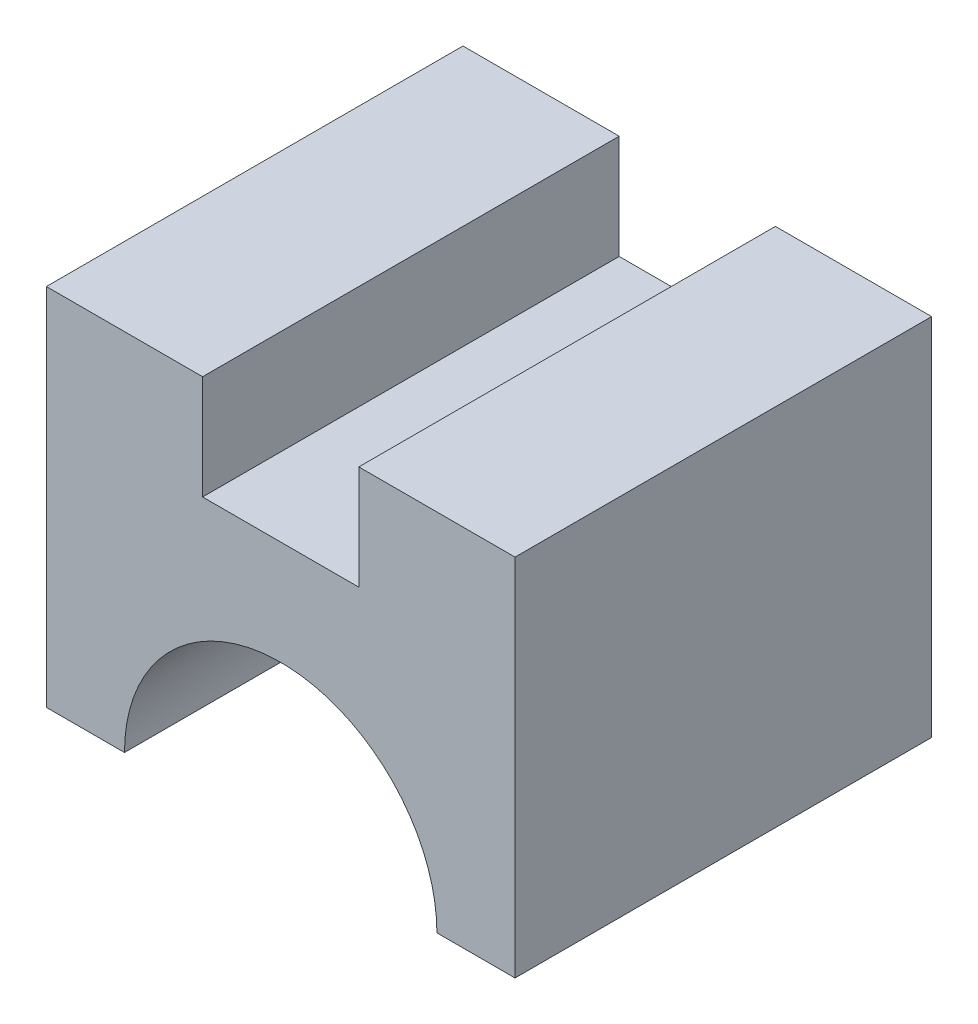
ISO-10303-21;
HEADER;
FILE_DESCRIPTION(('STEP AP214'),'2;1');
FILE_NAME('part.step','',(''),(''),'','','');
FILE_SCHEMA(('AUTOMOTIVE_DESIGN { 1 0 10303 214 1 1 1 1 }'));
ENDSEC;
DATA;
#1=APPLICATION_CONTEXT('core data for automotive mechanical design processes');
#2=APPLICATION_PROTOCOL_DEFINITION('international standard','automotive_design',2000,#1);
#3=PRODUCT_CONTEXT('',#1,'mechanical');
#4=PRODUCT('Part','Part','',(#3));
#5=PRODUCT_RELATED_PRODUCT_CATEGORY('part','',(#4));
#6=PRODUCT_DEFINITION_FORMATION('','',#4);
#7=PRODUCT_DEFINITION_CONTEXT('part definition',#1,'design');
#8=PRODUCT_DEFINITION('design','',#6,#7);
#9=PRODUCT_DEFINITION_SHAPE('','',#8);
#10=(LENGTH_UNIT() NAMED_UNIT(*) SI_UNIT(.MILLI.,.METRE.));
#11=(NAMED_UNIT(*) PLANE_ANGLE_UNIT() SI_UNIT($,.RADIAN.));
#12=(NAMED_UNIT(*) SI_UNIT($,.STERADIAN.) SOLID_ANGLE_UNIT());
#13=UNCERTAINTY_MEASURE_WITH_UNIT(LENGTH_MEASURE(1.E-05),#10,'distance_accuracy_value','');
#14=(GEOMETRIC_REPRESENTATION_CONTEXT(3) GLOBAL_UNCERTAINTY_ASSIGNED_CONTEXT((#13)) GLOBAL_UNIT_ASSIGNED_CONTEXT((#10,
#11,#12)) REPRESENTATION_CONTEXT('',''));
#15=CARTESIAN_POINT('',(0.,0.,0.));
#16=DIRECTION('',(0.,0.,1.));
#17=DIRECTION('',(1.,0.,0.));
#18=AXIS2_PLACEMENT_3D('',#15,#16,#17);
#19=CARTESIAN_POINT('',(0.,0.,1016.));
#20=DIRECTION('',(0.,0.,-1.));
#21=DIRECTION('',(-1.,0.,0.));
#22=AXIS2_PLACEMENT_3D('',#19,#20,#21);
#23=CYLINDRICAL_SURFACE('',#22,381.);
#24=CARTESIAN_POINT('',(0.,0.,0.));
#25=DIRECTION('',(0.,0.,-1.));
#26=DIRECTION('',(-1.,0.,0.));
#27=AXIS2_PLACEMENT_3D('',#24,#25,#26);
#28=CIRCLE('',#27,381.);
#29=CARTESIAN_POINT('',(-381.,0.,0.));
#30=VERTEX_POINT('',#29);
#31=CARTESIAN_POINT('',(381.,0.,0.));
#32=VERTEX_POINT('',#31);
#33=EDGE_CURVE('E141',#30,#32,#28,.T.);
#34=ORIENTED_EDGE('',*,*,#33,.T.);
#35=DIRECTION('',(0.,0.,-1.));
#36=VECTOR('',#35,1.);
#37=CARTESIAN_POINT('',(381.,0.,1016.));
#38=LINE('',#37,#36);
#39=CARTESIAN_POINT('',(381.,0.,1016.));
#40=VERTEX_POINT('',#39);
#41=EDGE_CURVE('E11',#40,#32,#38,.T.);
#42=ORIENTED_EDGE('',*,*,#41,.F.);
#43=CARTESIAN_POINT('',(0.,0.,1016.));
#44=DIRECTION('',(0.,0.,-1.));
#45=DIRECTION('',(-1.,0.,0.));
#46=AXIS2_PLACEMENT_3D('',#43,#44,#45);
#47=CIRCLE('',#46,381.);
#48=CARTESIAN_POINT('',(-381.,0.,1016.));
#49=VERTEX_POINT('',#48);
#50=EDGE_CURVE('E159',#49,#40,#47,.T.);
#51=ORIENTED_EDGE('',*,*,#50,.F.);
#52=DIRECTION('',(0.,0.,-1.));
#53=VECTOR('',#52,1.);
#54=CARTESIAN_POINT('',(-381.,0.,1016.));
#55=LINE('',#54,#53);
#56=EDGE_CURVE('E137',#49,#30,#55,.T.);
#57=ORIENTED_EDGE('',*,*,#56,.T.);
#58=EDGE_LOOP('',(#34,#42,#51,#57));
#59=FACE_BOUND('',#58,.T.);
#60=ADVANCED_FACE('F33',(#59),#23,.F.);
#61=CARTESIAN_POINT('',(381.,0.,1016.));
#62=DIRECTION('',(0.,1.,0.));
#63=DIRECTION('',(-1.,0.,0.));
#64=AXIS2_PLACEMENT_3D('',#61,#62,#63);
#65=PLANE('',#64);
#66=DIRECTION('',(1.,0.,0.));
#67=VECTOR('',#66,1.);
#68=CARTESIAN_POINT('',(381.,0.,0.));
#69=LINE('',#68,#67);
#70=CARTESIAN_POINT('',(571.5,1.98715083401274E-13,0.));
#71=VERTEX_POINT('',#70);
#72=EDGE_CURVE('E144',#32,#71,#69,.T.);
#73=ORIENTED_EDGE('',*,*,#72,.T.);
#74=DIRECTION('',(0.,0.,-1.));
#75=VECTOR('',#74,1.);
#76=CARTESIAN_POINT('',(571.5,1.98715083401274E-13,1016.));
#77=LINE('',#76,#75);
#78=CARTESIAN_POINT('',(571.5,1.98715083401274E-13,1016.));
#79=VERTEX_POINT('',#78);
#80=EDGE_CURVE('E41',#79,#71,#77,.T.);
#81=ORIENTED_EDGE('',*,*,#80,.F.);
#82=DIRECTION('',(1.,0.,0.));
#83=VECTOR('',#82,1.);
#84=CARTESIAN_POINT('',(381.,0.,1016.));
#85=LINE('',#84,#83);
#86=EDGE_CURVE('E98',#40,#79,#85,.T.);
#87=ORIENTED_EDGE('',*,*,#86,.F.);
#88=ORIENTED_EDGE('',*,*,#41,.T.);
#89=EDGE_LOOP('',(#73,#81,#87,#88));
#90=FACE_BOUND('',#89,.T.);
#91=ADVANCED_FACE('F208',(#90),#65,.F.);
#92=CARTESIAN_POINT('',(571.5,1.98715083401274E-13,1016.));
#93=DIRECTION('',(-1.,0.,0.));
#94=DIRECTION('',(0.,-1.,0.));
#95=AXIS2_PLACEMENT_3D('',#92,#93,#94);
#96=PLANE('',#95);
#97=DIRECTION('',(0.,1.,0.));
#98=VECTOR('',#97,1.);
#99=CARTESIAN_POINT('',(571.5,1.98715083401274E-13,0.));
#100=LINE('',#99,#98);
#101=CARTESIAN_POINT('',(571.5,889.,0.));
#102=VERTEX_POINT('',#101);
#103=EDGE_CURVE('E146',#71,#102,#100,.T.);
#104=ORIENTED_EDGE('',*,*,#103,.T.);
#105=DIRECTION('',(0.,0.,-1.));
#106=VECTOR('',#105,1.);
#107=CARTESIAN_POINT('',(571.5,889.,1016.));
#108=LINE('',#107,#106);
#109=CARTESIAN_POINT('',(571.5,889.,1016.));
#110=VERTEX_POINT('',#109);
#111=EDGE_CURVE('E172',#110,#102,#108,.T.);
#112=ORIENTED_EDGE('',*,*,#111,.F.);
#113=DIRECTION('',(0.,1.,0.));
#114=VECTOR('',#113,1.);
#115=CARTESIAN_POINT('',(571.5,1.98715083401274E-13,1016.));
#116=LINE('',#115,#114);
#117=EDGE_CURVE('E180',#79,#110,#116,.T.);
#118=ORIENTED_EDGE('',*,*,#117,.F.);
#119=ORIENTED_EDGE('',*,*,#80,.T.);
#120=EDGE_LOOP('',(#104,#112,#118,#119));
#121=FACE_BOUND('',#120,.T.);
#122=ADVANCED_FACE('F178',(#121),#96,.F.);
#123=CARTESIAN_POINT('',(571.5,889.,1016.));
#124=DIRECTION('',(0.,-1.,0.));
#125=DIRECTION('',(1.,0.,0.));
#126=AXIS2_PLACEMENT_3D('',#123,#124,#125);
#127=PLANE('',#126);
#128=DIRECTION('',(-1.,0.,0.));
#129=VECTOR('',#128,1.);
#130=CARTESIAN_POINT('',(571.5,889.,0.));
#131=LINE('',#130,#129);
#132=CARTESIAN_POINT('',(190.5,889.,0.));
#133=VERTEX_POINT('',#132);
#134=EDGE_CURVE('E148',#102,#133,#131,.T.);
#135=ORIENTED_EDGE('',*,*,#134,.T.);
#136=DIRECTION('',(0.,0.,-1.));
#137=VECTOR('',#136,1.);
#138=CARTESIAN_POINT('',(190.5,889.,1016.));
#139=LINE('',#138,#137);
#140=CARTESIAN_POINT('',(190.5,889.,1016.));
#141=VERTEX_POINT('',#140);
#142=EDGE_CURVE('E169',#141,#133,#139,.T.);
#143=ORIENTED_EDGE('',*,*,#142,.F.);
#144=DIRECTION('',(-1.,0.,0.));
#145=VECTOR('',#144,1.);
#146=CARTESIAN_POINT('',(571.5,889.,1016.));
#147=LINE('',#146,#145);
#148=EDGE_CURVE('E198',#110,#141,#147,.T.);
#149=ORIENTED_EDGE('',*,*,#148,.F.);
#150=ORIENTED_EDGE('',*,*,#111,.T.);
#151=EDGE_LOOP('',(#135,#143,#149,#150));
#152=FACE_BOUND('',#151,.T.);
#153=ADVANCED_FACE('F189',(#152),#127,.F.);
#154=CARTESIAN_POINT('',(190.5,889.,1016.));
#155=DIRECTION('',(1.,0.,0.));
#156=DIRECTION('',(0.,1.,0.));
#157=AXIS2_PLACEMENT_3D('',#154,#155,#156);
#158=PLANE('',#157);
#159=DIRECTION('',(0.,-1.,0.));
#160=VECTOR('',#159,1.);
#161=CARTESIAN_POINT('',(190.5,889.,0.));
#162=LINE('',#161,#160);
#163=CARTESIAN_POINT('',(190.5,635.,0.));
#164=VERTEX_POINT('',#163);
#165=EDGE_CURVE('E150',#133,#164,#162,.T.);
#166=ORIENTED_EDGE('',*,*,#165,.T.);
#167=DIRECTION('',(0.,0.,-1.));
#168=VECTOR('',#167,1.);
#169=CARTESIAN_POINT('',(190.5,635.,1016.));
#170=LINE('',#169,#168);
#171=CARTESIAN_POINT('',(190.5,635.,1016.));
#172=VERTEX_POINT('',#171);
#173=EDGE_CURVE('E166',#172,#164,#170,.T.);
#174=ORIENTED_EDGE('',*,*,#173,.F.);
#175=DIRECTION('',(0.,-1.,0.));
#176=VECTOR('',#175,1.);
#177=CARTESIAN_POINT('',(190.5,889.,1016.));
#178=LINE('',#177,#176);
#179=EDGE_CURVE('E195',#141,#172,#178,.T.);
#180=ORIENTED_EDGE('',*,*,#179,.F.);
#181=ORIENTED_EDGE('',*,*,#142,.T.);
#182=EDGE_LOOP('',(#166,#174,#180,#181));
#183=FACE_BOUND('',#182,.T.);
#184=ADVANCED_FACE('F193',(#183),#158,.F.);
#185=CARTESIAN_POINT('',(-190.5,635.,1016.));
#186=DIRECTION('',(0.,-1.,0.));
#187=DIRECTION('',(0.,0.,-1.));
#188=AXIS2_PLACEMENT_3D('',#185,#186,#187);
#189=PLANE('',#188);
#190=DIRECTION('',(-1.,0.,0.));
#191=VECTOR('',#190,1.);
#192=CARTESIAN_POINT('',(-190.5,635.,0.));
#193=LINE('',#192,#191);
#194=CARTESIAN_POINT('',(-190.5,635.,0.));
#195=VERTEX_POINT('',#194);
#196=EDGE_CURVE('E152',#164,#195,#193,.T.);
#197=ORIENTED_EDGE('',*,*,#196,.T.);
#198=DIRECTION('',(0.,0.,-1.));
#199=VECTOR('',#198,1.);
#200=CARTESIAN_POINT('',(-190.5,635.,1016.));
#201=LINE('',#200,#199);
#202=CARTESIAN_POINT('',(-190.5,635.,1016.));
#203=VERTEX_POINT('',#202);
#204=EDGE_CURVE('E163',#203,#195,#201,.T.);
#205=ORIENTED_EDGE('',*,*,#204,.F.);
#206=DIRECTION('',(-1.,0.,0.));
#207=VECTOR('',#206,1.);
#208=CARTESIAN_POINT('',(-190.5,635.,1016.));
#209=LINE('',#208,#207);
#210=EDGE_CURVE('E197',#172,#203,#209,.T.);
#211=ORIENTED_EDGE('',*,*,#210,.F.);
#212=ORIENTED_EDGE('',*,*,#173,.T.);
#213=EDGE_LOOP('',(#197,#205,#211,#212));
#214=FACE_BOUND('',#213,.T.);
#215=ADVANCED_FACE('F220',(#214),#189,.F.);
#216=CARTESIAN_POINT('',(-190.5,889.,1016.));
#217=DIRECTION('',(-1.,0.,0.));
#218=DIRECTION('',(0.,0.,1.));
#219=AXIS2_PLACEMENT_3D('',#216,#217,#218);
#220=PLANE('',#219);
#221=DIRECTION('',(0.,1.,0.));
#222=VECTOR('',#221,1.);
#223=CARTESIAN_POINT('',(-190.5,889.,0.));
#224=LINE('',#223,#222);
#225=CARTESIAN_POINT('',(-190.5,889.,0.));
#226=VERTEX_POINT('',#225);
#227=EDGE_CURVE('E154',#195,#226,#224,.T.);
#228=ORIENTED_EDGE('',*,*,#227,.T.);
#229=DIRECTION('',(0.,0.,-1.));
#230=VECTOR('',#229,1.);
#231=CARTESIAN_POINT('',(-190.5,889.,1016.));
#232=LINE('',#231,#230);
#233=CARTESIAN_POINT('',(-190.5,889.,1016.));
#234=VERTEX_POINT('',#233);
#235=EDGE_CURVE('E132',#234,#226,#232,.T.);
#236=ORIENTED_EDGE('',*,*,#235,.F.);
#237=DIRECTION('',(0.,1.,0.));
#238=VECTOR('',#237,1.);
#239=CARTESIAN_POINT('',(-190.5,889.,1016.));
#240=LINE('',#239,#238);
#241=EDGE_CURVE('E123',#203,#234,#240,.T.);
#242=ORIENTED_EDGE('',*,*,#241,.F.);
#243=ORIENTED_EDGE('',*,*,#204,.T.);
#244=EDGE_LOOP('',(#228,#236,#242,#243));
#245=FACE_BOUND('',#244,.T.);
#246=ADVANCED_FACE('F223',(#245),#220,.F.);
#247=CARTESIAN_POINT('',(-571.5,889.,1016.));
#248=DIRECTION('',(0.,-1.,0.));
#249=DIRECTION('',(1.,0.,0.));
#250=AXIS2_PLACEMENT_3D('',#247,#248,#249);
#251=PLANE('',#250);
#252=DIRECTION('',(-1.,0.,0.));
#253=VECTOR('',#252,1.);
#254=CARTESIAN_POINT('',(-571.5,889.,0.));
#255=LINE('',#254,#253);
#256=CARTESIAN_POINT('',(-571.5,889.,0.));
#257=VERTEX_POINT('',#256);
#258=EDGE_CURVE('E131',#226,#257,#255,.T.);
#259=ORIENTED_EDGE('',*,*,#258,.T.);
#260=DIRECTION('',(0.,0.,-1.));
#261=VECTOR('',#260,1.);
#262=CARTESIAN_POINT('',(-571.5,889.,1016.));
#263=LINE('',#262,#261);
#264=CARTESIAN_POINT('',(-571.5,889.,1016.));
#265=VERTEX_POINT('',#264);
#266=EDGE_CURVE('E128',#265,#257,#263,.T.);
#267=ORIENTED_EDGE('',*,*,#266,.F.);
#268=DIRECTION('',(-1.,0.,0.));
#269=VECTOR('',#268,1.);
#270=CARTESIAN_POINT('',(-571.5,889.,1016.));
#271=LINE('',#270,#269);
#272=EDGE_CURVE('E117',#234,#265,#271,.T.);
#273=ORIENTED_EDGE('',*,*,#272,.F.);
#274=ORIENTED_EDGE('',*,*,#235,.T.);
#275=EDGE_LOOP('',(#259,#267,#273,#274));
#276=FACE_BOUND('',#275,.T.);
#277=ADVANCED_FACE('F129',(#276),#251,.F.);
#278=CARTESIAN_POINT('',(-571.5,0.,1016.));
#279=DIRECTION('',(1.,0.,0.));
#280=DIRECTION('',(0.,0.,-1.));
#281=AXIS2_PLACEMENT_3D('',#278,#279,#280);
#282=PLANE('',#281);
#283=DIRECTION('',(0.,-1.,0.));
#284=VECTOR('',#283,1.);
#285=CARTESIAN_POINT('',(-571.5,0.,0.));
#286=LINE('',#285,#284);
#287=CARTESIAN_POINT('',(-571.5,0.,0.));
#288=VERTEX_POINT('',#287);
#289=EDGE_CURVE('E84',#257,#288,#286,.T.);
#290=ORIENTED_EDGE('',*,*,#289,.T.);
#291=DIRECTION('',(0.,0.,-1.));
#292=VECTOR('',#291,1.);
#293=CARTESIAN_POINT('',(-571.5,0.,1016.));
#294=LINE('',#293,#292);
#295=CARTESIAN_POINT('',(-571.5,0.,1016.));
#296=VERTEX_POINT('',#295);
#297=EDGE_CURVE('E133',#296,#288,#294,.T.);
#298=ORIENTED_EDGE('',*,*,#297,.F.);
#299=DIRECTION('',(0.,-1.,0.));
#300=VECTOR('',#299,1.);
#301=CARTESIAN_POINT('',(-571.5,0.,1016.));
#302=LINE('',#301,#300);
#303=EDGE_CURVE('E121',#265,#296,#302,.T.);
#304=ORIENTED_EDGE('',*,*,#303,.F.);
#305=ORIENTED_EDGE('',*,*,#266,.T.);
#306=EDGE_LOOP('',(#290,#298,#304,#305));
#307=FACE_BOUND('',#306,.T.);
#308=ADVANCED_FACE('F135',(#307),#282,.F.);
#309=CARTESIAN_POINT('',(-381.,0.,1016.));
#310=DIRECTION('',(0.,1.,0.));
#311=DIRECTION('',(-1.,0.,0.));
#312=AXIS2_PLACEMENT_3D('',#309,#310,#311);
#313=PLANE('',#312);
#314=DIRECTION('',(1.,0.,0.));
#315=VECTOR('',#314,1.);
#316=CARTESIAN_POINT('',(-381.,0.,0.));
#317=LINE('',#316,#315);
#318=EDGE_CURVE('E90',#288,#30,#317,.T.);
#319=ORIENTED_EDGE('',*,*,#318,.T.);
#320=ORIENTED_EDGE('',*,*,#56,.F.);
#321=DIRECTION('',(1.,0.,0.));
#322=VECTOR('',#321,1.);
#323=CARTESIAN_POINT('',(-381.,0.,1016.));
#324=LINE('',#323,#322);
#325=EDGE_CURVE('E49',#296,#49,#324,.T.);
#326=ORIENTED_EDGE('',*,*,#325,.F.);
#327=ORIENTED_EDGE('',*,*,#297,.T.);
#328=EDGE_LOOP('',(#319,#320,#326,#327));
#329=FACE_BOUND('',#328,.T.);
#330=ADVANCED_FACE('F232',(#329),#313,.F.);
#331=CARTESIAN_POINT('',(0.,0.,1016.));
#332=DIRECTION('',(0.,0.,-1.));
#333=DIRECTION('',(-1.,0.,0.));
#334=AXIS2_PLACEMENT_3D('',#331,#332,#333);
#335=PLANE('',#334);
#336=ORIENTED_EDGE('',*,*,#50,.T.);
#337=ORIENTED_EDGE('',*,*,#86,.T.);
#338=ORIENTED_EDGE('',*,*,#117,.T.);
#339=ORIENTED_EDGE('',*,*,#148,.T.);
#340=ORIENTED_EDGE('',*,*,#179,.T.);
#341=ORIENTED_EDGE('',*,*,#210,.T.);
#342=ORIENTED_EDGE('',*,*,#241,.T.);
#343=ORIENTED_EDGE('',*,*,#272,.T.);
#344=ORIENTED_EDGE('',*,*,#303,.T.);
#345=ORIENTED_EDGE('',*,*,#325,.T.);
#346=EDGE_LOOP('',(#336,#337,#338,#339,#340,#341,#342,#343,#344,#345));
#347=FACE_BOUND('',#346,.T.);
#348=ADVANCED_FACE('F119',(#347),#335,.F.);
#349=CARTESIAN_POINT('',(0.,0.,0.));
#350=DIRECTION('',(0.,0.,-1.));
#351=DIRECTION('',(-1.,0.,0.));
#352=AXIS2_PLACEMENT_3D('',#349,#350,#351);
#353=PLANE('',#352);
#354=ORIENTED_EDGE('',*,*,#33,.F.);
#355=ORIENTED_EDGE('',*,*,#318,.F.);
#356=ORIENTED_EDGE('',*,*,#289,.F.);
#357=ORIENTED_EDGE('',*,*,#258,.F.);
#358=ORIENTED_EDGE('',*,*,#227,.F.);
#359=ORIENTED_EDGE('',*,*,#196,.F.);
#360=ORIENTED_EDGE('',*,*,#165,.F.);
#361=ORIENTED_EDGE('',*,*,#134,.F.);
#362=ORIENTED_EDGE('',*,*,#103,.F.);
#363=ORIENTED_EDGE('',*,*,#72,.F.);
#364=EDGE_LOOP('',(#354,#355,#356,#357,#358,#359,#360,#361,#362,#363));
#365=FACE_BOUND('',#364,.T.);
#366=ADVANCED_FACE('F184',(#365),#353,.T.);
#367=CLOSED_SHELL('',(#60,#91,#122,#153,#184,#215,#246,#277,#308,#330,#348,#366));
#368=MANIFOLD_SOLID_BREP('B2',#367);
#369=ADVANCED_BREP_SHAPE_REPRESENTATION('',(#18,#368),#14);
#370=SHAPE_DEFINITION_REPRESENTATION(#9,#369);
ENDSEC;
END-ISO-10303-21;
